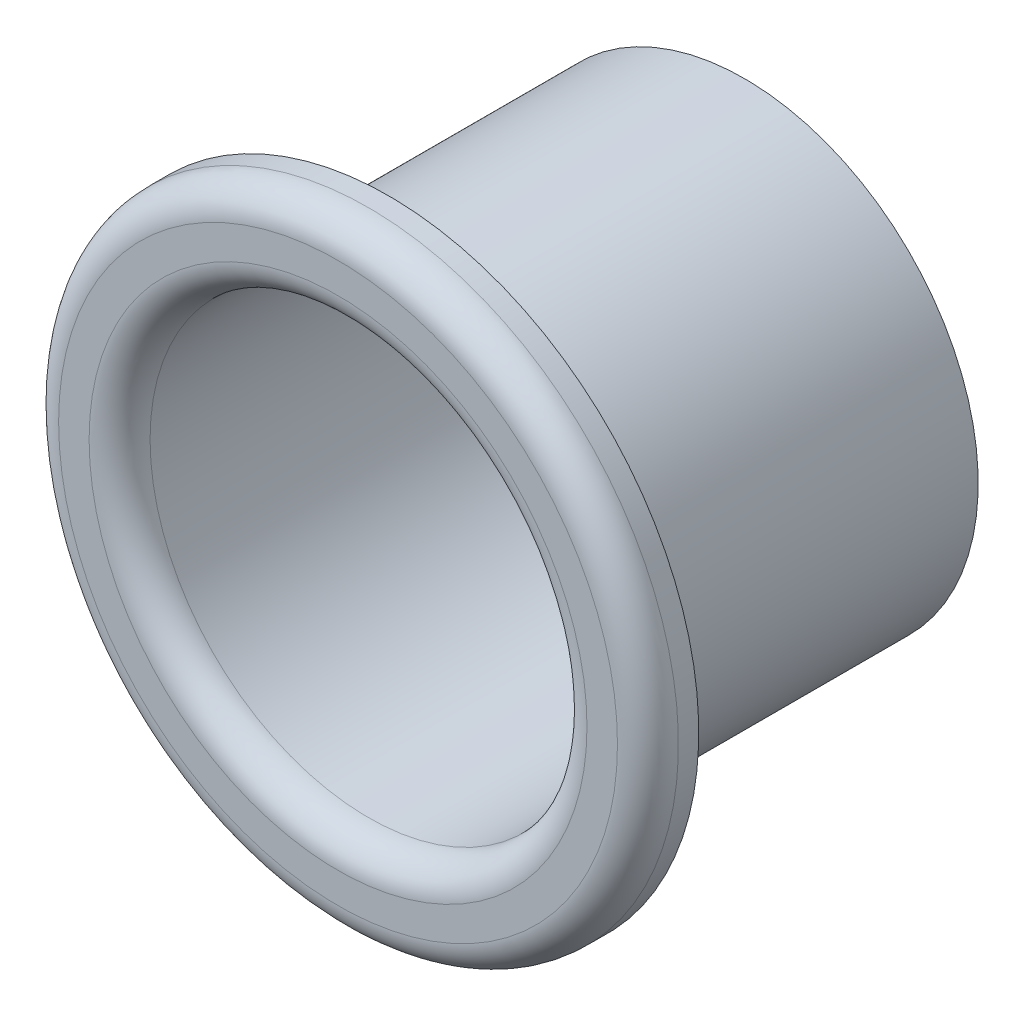
ISO-10303-21;
HEADER;
FILE_DESCRIPTION(('STEP AP214'),'2;1');
FILE_NAME('part.step','',(''),(''),'','','');
FILE_SCHEMA(('AUTOMOTIVE_DESIGN { 1 0 10303 214 1 1 1 1 }'));
ENDSEC;
DATA;
#1=APPLICATION_CONTEXT('core data for automotive mechanical design processes');
#2=APPLICATION_PROTOCOL_DEFINITION('international standard','automotive_design',2000,#1);
#3=PRODUCT_CONTEXT('',#1,'mechanical');
#4=PRODUCT('Part','Part','',(#3));
#5=PRODUCT_RELATED_PRODUCT_CATEGORY('part','',(#4));
#6=PRODUCT_DEFINITION_FORMATION('','',#4);
#7=PRODUCT_DEFINITION_CONTEXT('part definition',#1,'design');
#8=PRODUCT_DEFINITION('design','',#6,#7);
#9=PRODUCT_DEFINITION_SHAPE('','',#8);
#10=(LENGTH_UNIT() NAMED_UNIT(*) SI_UNIT(.MILLI.,.METRE.));
#11=(NAMED_UNIT(*) PLANE_ANGLE_UNIT() SI_UNIT($,.RADIAN.));
#12=(NAMED_UNIT(*) SI_UNIT($,.STERADIAN.) SOLID_ANGLE_UNIT());
#13=UNCERTAINTY_MEASURE_WITH_UNIT(LENGTH_MEASURE(1.E-05),#10,'distance_accuracy_value','');
#14=(GEOMETRIC_REPRESENTATION_CONTEXT(3) GLOBAL_UNCERTAINTY_ASSIGNED_CONTEXT((#13)) GLOBAL_UNIT_ASSIGNED_CONTEXT((#10,
#11,#12)) REPRESENTATION_CONTEXT('',''));
#15=CARTESIAN_POINT('',(0.,0.,0.));
#16=DIRECTION('',(0.,0.,1.));
#17=DIRECTION('',(1.,0.,0.));
#18=AXIS2_PLACEMENT_3D('',#15,#16,#17);
#19=CARTESIAN_POINT('',(0.,29.,-5.));
#20=DIRECTION('',(0.,0.,-1.));
#21=DIRECTION('',(-1.,0.,0.));
#22=AXIS2_PLACEMENT_3D('',#19,#20,#21);
#23=PLANE('',#22);
#24=CARTESIAN_POINT('',(0.,0.,-5.));
#25=DIRECTION('',(0.,0.,-1.));
#26=DIRECTION('',(-1.,0.,0.));
#27=AXIS2_PLACEMENT_3D('',#24,#25,#26);
#28=CIRCLE('',#27,30.5);
#29=CARTESIAN_POINT('',(-30.5,0.,-5.));
#30=VERTEX_POINT('',#29);
#31=EDGE_CURVE('E10',#30,#30,#28,.T.);
#32=ORIENTED_EDGE('',*,*,#31,.T.);
#33=EDGE_LOOP('',(#32));
#34=FACE_BOUND('',#33,.T.);
#35=CARTESIAN_POINT('',(0.,0.,-5.));
#36=DIRECTION('',(0.,0.,-1.));
#37=DIRECTION('',(-1.,0.,0.));
#38=AXIS2_PLACEMENT_3D('',#35,#36,#37);
#39=CIRCLE('',#38,29.);
#40=CARTESIAN_POINT('',(-29.,0.,-5.));
#41=VERTEX_POINT('',#40);
#42=EDGE_CURVE('E77',#41,#41,#39,.T.);
#43=ORIENTED_EDGE('',*,*,#42,.F.);
#44=EDGE_LOOP('',(#43));
#45=FACE_BOUND('',#44,.T.);
#46=ADVANCED_FACE('F37',(#34,#45),#23,.T.);
#47=CARTESIAN_POINT('',(0.,0.,0.));
#48=DIRECTION('',(0.,0.,-1.));
#49=DIRECTION('',(-1.,0.,0.));
#50=AXIS2_PLACEMENT_3D('',#47,#48,#49);
#51=CYLINDRICAL_SURFACE('',#50,30.5);
#52=CARTESIAN_POINT('',(0.,0.,-3.));
#53=DIRECTION('',(0.,0.,-1.));
#54=DIRECTION('',(-1.,0.,0.));
#55=AXIS2_PLACEMENT_3D('',#52,#53,#54);
#56=CIRCLE('',#55,30.5);
#57=CARTESIAN_POINT('',(-30.5,0.,-3.));
#58=VERTEX_POINT('',#57);
#59=EDGE_CURVE('E43',#58,#58,#56,.T.);
#60=ORIENTED_EDGE('',*,*,#59,.T.);
#61=EDGE_LOOP('',(#60));
#62=FACE_BOUND('',#61,.T.);
#63=ORIENTED_EDGE('',*,*,#31,.F.);
#64=EDGE_LOOP('',(#63));
#65=FACE_BOUND('',#64,.T.);
#66=ADVANCED_FACE('F85',(#62,#65),#51,.T.);
#67=CARTESIAN_POINT('',(0.,0.,-3.));
#68=DIRECTION('',(0.,0.,-1.));
#69=DIRECTION('',(-1.,0.,0.));
#70=AXIS2_PLACEMENT_3D('',#67,#68,#69);
#71=TOROIDAL_SURFACE('',#70,27.5,3.);
#72=CARTESIAN_POINT('',(0.,0.,0.));
#73=DIRECTION('',(0.,0.,-1.));
#74=DIRECTION('',(-1.,0.,0.));
#75=AXIS2_PLACEMENT_3D('',#72,#73,#74);
#76=CIRCLE('',#75,27.5);
#77=CARTESIAN_POINT('',(-27.5,0.,0.));
#78=VERTEX_POINT('',#77);
#79=EDGE_CURVE('E47',#78,#78,#76,.T.);
#80=ORIENTED_EDGE('',*,*,#79,.T.);
#81=EDGE_LOOP('',(#80));
#82=FACE_BOUND('',#81,.T.);
#83=ORIENTED_EDGE('',*,*,#59,.F.);
#84=EDGE_LOOP('',(#83));
#85=FACE_BOUND('',#84,.T.);
#86=ADVANCED_FACE('F89',(#82,#85),#71,.T.);
#87=CARTESIAN_POINT('',(0.,27.5,0.));
#88=DIRECTION('',(0.,0.,1.));
#89=DIRECTION('',(1.,0.,0.));
#90=AXIS2_PLACEMENT_3D('',#87,#88,#89);
#91=PLANE('',#90);
#92=CARTESIAN_POINT('',(0.,0.,0.));
#93=DIRECTION('',(0.,0.,-1.));
#94=DIRECTION('',(-1.,0.,0.));
#95=AXIS2_PLACEMENT_3D('',#92,#93,#94);
#96=CIRCLE('',#95,24.5000000000002);
#97=CARTESIAN_POINT('',(-24.5000000000002,0.,0.));
#98=VERTEX_POINT('',#97);
#99=EDGE_CURVE('E51',#98,#98,#96,.T.);
#100=ORIENTED_EDGE('',*,*,#99,.T.);
#101=EDGE_LOOP('',(#100));
#102=FACE_BOUND('',#101,.T.);
#103=ORIENTED_EDGE('',*,*,#79,.F.);
#104=EDGE_LOOP('',(#103));
#105=FACE_BOUND('',#104,.T.);
#106=ADVANCED_FACE('F93',(#102,#105),#91,.T.);
#107=CARTESIAN_POINT('',(0.,0.,-3.));
#108=DIRECTION('',(0.,0.,-1.));
#109=DIRECTION('',(-1.,0.,0.));
#110=AXIS2_PLACEMENT_3D('',#107,#108,#109);
#111=TOROIDAL_SURFACE('',#110,24.5000000000002,3.);
#112=CARTESIAN_POINT('',(0.,0.,-3.00000000000002));
#113=DIRECTION('',(0.,0.,-1.));
#114=DIRECTION('',(-1.,0.,0.));
#115=AXIS2_PLACEMENT_3D('',#112,#113,#114);
#116=CIRCLE('',#115,21.5000000000002);
#117=CARTESIAN_POINT('',(-21.5000000000002,0.,-3.00000000000002));
#118=VERTEX_POINT('',#117);
#119=EDGE_CURVE('E56',#118,#118,#116,.T.);
#120=ORIENTED_EDGE('',*,*,#119,.T.);
#121=EDGE_LOOP('',(#120));
#122=FACE_BOUND('',#121,.T.);
#123=ORIENTED_EDGE('',*,*,#99,.F.);
#124=EDGE_LOOP('',(#123));
#125=FACE_BOUND('',#124,.T.);
#126=ADVANCED_FACE('F100',(#122,#125),#111,.T.);
#127=CARTESIAN_POINT('',(0.,0.,0.));
#128=DIRECTION('',(0.,0.,-1.));
#129=DIRECTION('',(-1.,0.,0.));
#130=AXIS2_PLACEMENT_3D('',#127,#128,#129);
#131=CYLINDRICAL_SURFACE('',#130,21.5000000000001);
#132=CARTESIAN_POINT('',(0.,0.,-40.));
#133=DIRECTION('',(0.,0.,-1.));
#134=DIRECTION('',(-1.,0.,0.));
#135=AXIS2_PLACEMENT_3D('',#132,#133,#134);
#136=CIRCLE('',#135,21.5);
#137=CARTESIAN_POINT('',(-21.5,0.,-40.));
#138=VERTEX_POINT('',#137);
#139=EDGE_CURVE('E59',#138,#138,#136,.T.);
#140=ORIENTED_EDGE('',*,*,#139,.T.);
#141=EDGE_LOOP('',(#140));
#142=FACE_BOUND('',#141,.T.);
#143=ORIENTED_EDGE('',*,*,#119,.F.);
#144=EDGE_LOOP('',(#143));
#145=FACE_BOUND('',#144,.T.);
#146=ADVANCED_FACE('F104',(#142,#145),#131,.F.);
#147=CARTESIAN_POINT('',(0.,23.,-40.));
#148=DIRECTION('',(0.,0.,-1.));
#149=DIRECTION('',(-1.,0.,0.));
#150=AXIS2_PLACEMENT_3D('',#147,#148,#149);
#151=PLANE('',#150);
#152=CARTESIAN_POINT('',(0.,0.,-40.));
#153=DIRECTION('',(0.,0.,-1.));
#154=DIRECTION('',(-1.,0.,0.));
#155=AXIS2_PLACEMENT_3D('',#152,#153,#154);
#156=CIRCLE('',#155,23.);
#157=CARTESIAN_POINT('',(-23.,0.,-40.));
#158=VERTEX_POINT('',#157);
#159=EDGE_CURVE('E62',#158,#158,#156,.T.);
#160=ORIENTED_EDGE('',*,*,#159,.T.);
#161=EDGE_LOOP('',(#160));
#162=FACE_BOUND('',#161,.T.);
#163=ORIENTED_EDGE('',*,*,#139,.F.);
#164=EDGE_LOOP('',(#163));
#165=FACE_BOUND('',#164,.T.);
#166=ADVANCED_FACE('F108',(#162,#165),#151,.T.);
#167=CARTESIAN_POINT('',(0.,0.,0.));
#168=DIRECTION('',(0.,0.,-1.));
#169=DIRECTION('',(-1.,0.,0.));
#170=AXIS2_PLACEMENT_3D('',#167,#168,#169);
#171=CYLINDRICAL_SURFACE('',#170,23.);
#172=CARTESIAN_POINT('',(0.,0.,-3.));
#173=DIRECTION('',(0.,0.,-1.));
#174=DIRECTION('',(-1.,0.,0.));
#175=AXIS2_PLACEMENT_3D('',#172,#173,#174);
#176=CIRCLE('',#175,23.);
#177=CARTESIAN_POINT('',(-23.,0.,-3.));
#178=VERTEX_POINT('',#177);
#179=EDGE_CURVE('E65',#178,#178,#176,.T.);
#180=ORIENTED_EDGE('',*,*,#179,.T.);
#181=EDGE_LOOP('',(#180));
#182=FACE_BOUND('',#181,.T.);
#183=ORIENTED_EDGE('',*,*,#159,.F.);
#184=EDGE_LOOP('',(#183));
#185=FACE_BOUND('',#184,.T.);
#186=ADVANCED_FACE('F112',(#182,#185),#171,.T.);
#187=CARTESIAN_POINT('',(0.,0.,-3.));
#188=DIRECTION('',(0.,0.,-1.));
#189=DIRECTION('',(-1.,0.,0.));
#190=AXIS2_PLACEMENT_3D('',#187,#188,#189);
#191=TOROIDAL_SURFACE('',#190,24.5000000000002,1.5000000000001);
#192=CARTESIAN_POINT('',(0.,0.,-1.4999999999999));
#193=DIRECTION('',(0.,0.,-1.));
#194=DIRECTION('',(-1.,0.,0.));
#195=AXIS2_PLACEMENT_3D('',#192,#193,#194);
#196=CIRCLE('',#195,24.5);
#197=CARTESIAN_POINT('',(-24.5,0.,-1.4999999999999));
#198=VERTEX_POINT('',#197);
#199=EDGE_CURVE('E68',#198,#198,#196,.T.);
#200=ORIENTED_EDGE('',*,*,#199,.T.);
#201=EDGE_LOOP('',(#200));
#202=FACE_BOUND('',#201,.T.);
#203=ORIENTED_EDGE('',*,*,#179,.F.);
#204=EDGE_LOOP('',(#203));
#205=FACE_BOUND('',#204,.T.);
#206=ADVANCED_FACE('F116',(#202,#205),#191,.F.);
#207=CARTESIAN_POINT('',(0.,27.5,-1.49999999999995));
#208=DIRECTION('',(0.,0.,-1.));
#209=DIRECTION('',(-1.,0.,0.));
#210=AXIS2_PLACEMENT_3D('',#207,#208,#209);
#211=PLANE('',#210);
#212=CARTESIAN_POINT('',(0.,0.,-1.5));
#213=DIRECTION('',(0.,0.,-1.));
#214=DIRECTION('',(-1.,0.,0.));
#215=AXIS2_PLACEMENT_3D('',#212,#213,#214);
#216=CIRCLE('',#215,27.5);
#217=CARTESIAN_POINT('',(-27.5,0.,-1.5));
#218=VERTEX_POINT('',#217);
#219=EDGE_CURVE('E71',#218,#218,#216,.T.);
#220=ORIENTED_EDGE('',*,*,#219,.T.);
#221=EDGE_LOOP('',(#220));
#222=FACE_BOUND('',#221,.T.);
#223=ORIENTED_EDGE('',*,*,#199,.F.);
#224=EDGE_LOOP('',(#223));
#225=FACE_BOUND('',#224,.T.);
#226=ADVANCED_FACE('F120',(#222,#225),#211,.T.);
#227=CARTESIAN_POINT('',(0.,0.,-3.));
#228=DIRECTION('',(0.,0.,-1.));
#229=DIRECTION('',(-1.,0.,0.));
#230=AXIS2_PLACEMENT_3D('',#227,#228,#229);
#231=TOROIDAL_SURFACE('',#230,27.5,1.5);
#232=CARTESIAN_POINT('',(0.,0.,-3.));
#233=DIRECTION('',(0.,0.,-1.));
#234=DIRECTION('',(-1.,0.,0.));
#235=AXIS2_PLACEMENT_3D('',#232,#233,#234);
#236=CIRCLE('',#235,29.);
#237=CARTESIAN_POINT('',(-29.,0.,-3.));
#238=VERTEX_POINT('',#237);
#239=EDGE_CURVE('E74',#238,#238,#236,.T.);
#240=ORIENTED_EDGE('',*,*,#239,.T.);
#241=EDGE_LOOP('',(#240));
#242=FACE_BOUND('',#241,.T.);
#243=ORIENTED_EDGE('',*,*,#219,.F.);
#244=EDGE_LOOP('',(#243));
#245=FACE_BOUND('',#244,.T.);
#246=ADVANCED_FACE('F124',(#242,#245),#231,.F.);
#247=CARTESIAN_POINT('',(0.,0.,0.));
#248=DIRECTION('',(0.,0.,-1.));
#249=DIRECTION('',(-1.,0.,0.));
#250=AXIS2_PLACEMENT_3D('',#247,#248,#249);
#251=CYLINDRICAL_SURFACE('',#250,29.);
#252=ORIENTED_EDGE('',*,*,#42,.T.);
#253=EDGE_LOOP('',(#252));
#254=FACE_BOUND('',#253,.T.);
#255=ORIENTED_EDGE('',*,*,#239,.F.);
#256=EDGE_LOOP('',(#255));
#257=FACE_BOUND('',#256,.T.);
#258=ADVANCED_FACE('F81',(#254,#257),#251,.F.);
#259=CLOSED_SHELL('',(#46,#66,#86,#106,#126,#146,#166,#186,#206,#226,#246,#258));
#260=MANIFOLD_SOLID_BREP('B2',#259);
#261=ADVANCED_BREP_SHAPE_REPRESENTATION('',(#18,#260),#14);
#262=SHAPE_DEFINITION_REPRESENTATION(#9,#261);
ENDSEC;
END-ISO-10303-21;
